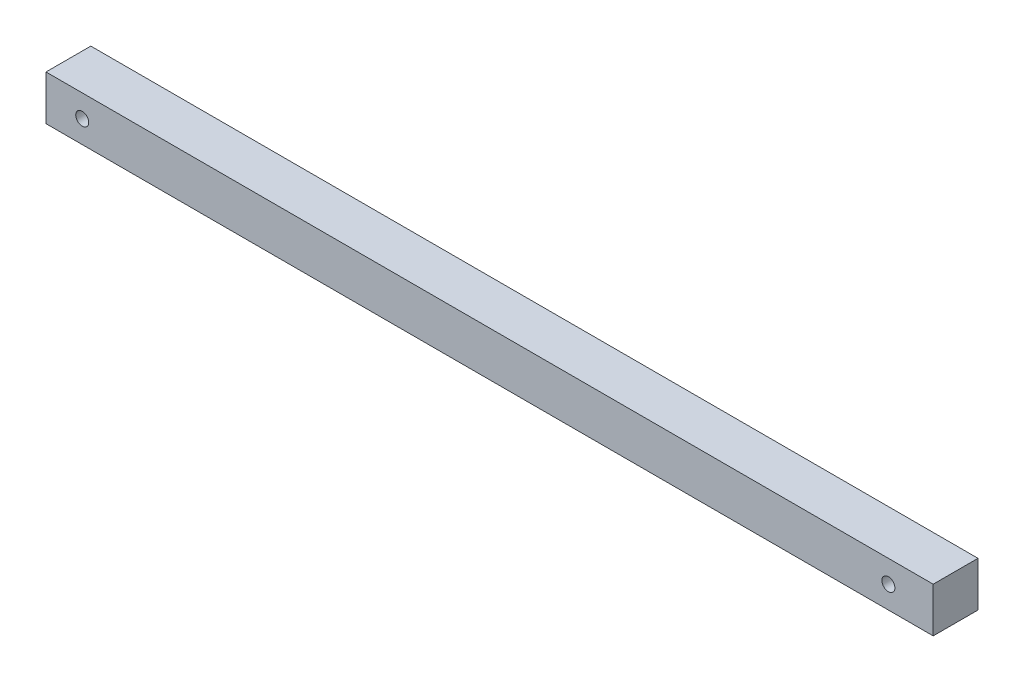
ISO-10303-21;
HEADER;
FILE_DESCRIPTION(('STEP AP214'),'2;1');
FILE_NAME('part.step','',(''),(''),'','','');
FILE_SCHEMA(('AUTOMOTIVE_DESIGN { 1 0 10303 214 1 1 1 1 }'));
ENDSEC;
DATA;
#1=APPLICATION_CONTEXT('core data for automotive mechanical design processes');
#2=APPLICATION_PROTOCOL_DEFINITION('international standard','automotive_design',2000,#1);
#3=PRODUCT_CONTEXT('',#1,'mechanical');
#4=PRODUCT('Part','Part','',(#3));
#5=PRODUCT_RELATED_PRODUCT_CATEGORY('part','',(#4));
#6=PRODUCT_DEFINITION_FORMATION('','',#4);
#7=PRODUCT_DEFINITION_CONTEXT('part definition',#1,'design');
#8=PRODUCT_DEFINITION('design','',#6,#7);
#9=PRODUCT_DEFINITION_SHAPE('','',#8);
#10=(LENGTH_UNIT() NAMED_UNIT(*) SI_UNIT(.MILLI.,.METRE.));
#11=(NAMED_UNIT(*) PLANE_ANGLE_UNIT() SI_UNIT($,.RADIAN.));
#12=(NAMED_UNIT(*) SI_UNIT($,.STERADIAN.) SOLID_ANGLE_UNIT());
#13=UNCERTAINTY_MEASURE_WITH_UNIT(LENGTH_MEASURE(1.E-05),#10,'distance_accuracy_value','');
#14=(GEOMETRIC_REPRESENTATION_CONTEXT(3) GLOBAL_UNCERTAINTY_ASSIGNED_CONTEXT((#13)) GLOBAL_UNIT_ASSIGNED_CONTEXT((#10,
#11,#12)) REPRESENTATION_CONTEXT('',''));
#15=CARTESIAN_POINT('',(0.,0.,0.));
#16=DIRECTION('',(0.,0.,1.));
#17=DIRECTION('',(1.,0.,0.));
#18=AXIS2_PLACEMENT_3D('',#15,#16,#17);
#19=CARTESIAN_POINT('',(-99.,4.99999999999999,5.));
#20=DIRECTION('',(1.,0.,0.));
#21=DIRECTION('',(0.,0.,-1.));
#22=AXIS2_PLACEMENT_3D('',#19,#20,#21);
#23=PLANE('',#22);
#24=DIRECTION('',(0.,-1.,0.));
#25=VECTOR('',#24,1.);
#26=CARTESIAN_POINT('',(-99.,4.99999999999999,-5.));
#27=LINE('',#26,#25);
#28=CARTESIAN_POINT('',(-99.,4.99999999999999,-5.));
#29=VERTEX_POINT('',#28);
#30=CARTESIAN_POINT('',(-99.,-5.00000000000001,-5.));
#31=VERTEX_POINT('',#30);
#32=EDGE_CURVE('E96',#29,#31,#27,.T.);
#33=ORIENTED_EDGE('',*,*,#32,.T.);
#34=DIRECTION('',(0.,0.,-1.));
#35=VECTOR('',#34,1.);
#36=CARTESIAN_POINT('',(-99.,-5.00000000000001,5.));
#37=LINE('',#36,#35);
#38=CARTESIAN_POINT('',(-99.,-5.00000000000001,5.));
#39=VERTEX_POINT('',#38);
#40=EDGE_CURVE('E11',#39,#31,#37,.T.);
#41=ORIENTED_EDGE('',*,*,#40,.F.);
#42=DIRECTION('',(0.,-1.,0.));
#43=VECTOR('',#42,1.);
#44=CARTESIAN_POINT('',(-99.,4.99999999999999,5.));
#45=LINE('',#44,#43);
#46=CARTESIAN_POINT('',(-99.,4.99999999999999,5.));
#47=VERTEX_POINT('',#46);
#48=EDGE_CURVE('E84',#47,#39,#45,.T.);
#49=ORIENTED_EDGE('',*,*,#48,.F.);
#50=DIRECTION('',(0.,0.,-1.));
#51=VECTOR('',#50,1.);
#52=CARTESIAN_POINT('',(-99.,4.99999999999999,5.));
#53=LINE('',#52,#51);
#54=EDGE_CURVE('E92',#47,#29,#53,.T.);
#55=ORIENTED_EDGE('',*,*,#54,.T.);
#56=EDGE_LOOP('',(#33,#41,#49,#55));
#57=FACE_BOUND('',#56,.T.);
#58=ADVANCED_FACE('F33',(#57),#23,.F.);
#59=CARTESIAN_POINT('',(99.,-4.99999999999999,5.));
#60=DIRECTION('',(0.,1.,0.));
#61=DIRECTION('',(-1.,0.,0.));
#62=AXIS2_PLACEMENT_3D('',#59,#60,#61);
#63=PLANE('',#62);
#64=DIRECTION('',(1.,0.,0.));
#65=VECTOR('',#64,1.);
#66=CARTESIAN_POINT('',(99.,-4.99999999999999,-5.));
#67=LINE('',#66,#65);
#68=CARTESIAN_POINT('',(99.,-4.99999999999999,-5.));
#69=VERTEX_POINT('',#68);
#70=EDGE_CURVE('E88',#31,#69,#67,.T.);
#71=ORIENTED_EDGE('',*,*,#70,.T.);
#72=DIRECTION('',(0.,0.,-1.));
#73=VECTOR('',#72,1.);
#74=CARTESIAN_POINT('',(99.,-4.99999999999999,5.));
#75=LINE('',#74,#73);
#76=CARTESIAN_POINT('',(99.,-4.99999999999999,5.));
#77=VERTEX_POINT('',#76);
#78=EDGE_CURVE('E41',#77,#69,#75,.T.);
#79=ORIENTED_EDGE('',*,*,#78,.F.);
#80=DIRECTION('',(1.,0.,0.));
#81=VECTOR('',#80,1.);
#82=CARTESIAN_POINT('',(99.,-4.99999999999999,5.));
#83=LINE('',#82,#81);
#84=EDGE_CURVE('E79',#39,#77,#83,.T.);
#85=ORIENTED_EDGE('',*,*,#84,.F.);
#86=ORIENTED_EDGE('',*,*,#40,.T.);
#87=EDGE_LOOP('',(#71,#79,#85,#86));
#88=FACE_BOUND('',#87,.T.);
#89=ADVANCED_FACE('F87',(#88),#63,.F.);
#90=CARTESIAN_POINT('',(99.,5.00000000000001,5.));
#91=DIRECTION('',(-1.,0.,0.));
#92=DIRECTION('',(0.,0.,1.));
#93=AXIS2_PLACEMENT_3D('',#90,#91,#92);
#94=PLANE('',#93);
#95=DIRECTION('',(0.,1.,0.));
#96=VECTOR('',#95,1.);
#97=CARTESIAN_POINT('',(99.,5.00000000000001,-5.));
#98=LINE('',#97,#96);
#99=CARTESIAN_POINT('',(99.,5.00000000000001,-5.));
#100=VERTEX_POINT('',#99);
#101=EDGE_CURVE('E66',#69,#100,#98,.T.);
#102=ORIENTED_EDGE('',*,*,#101,.T.);
#103=DIRECTION('',(0.,0.,-1.));
#104=VECTOR('',#103,1.);
#105=CARTESIAN_POINT('',(99.,5.00000000000001,5.));
#106=LINE('',#105,#104);
#107=CARTESIAN_POINT('',(99.,5.00000000000001,5.));
#108=VERTEX_POINT('',#107);
#109=EDGE_CURVE('E89',#108,#100,#106,.T.);
#110=ORIENTED_EDGE('',*,*,#109,.F.);
#111=DIRECTION('',(0.,1.,0.));
#112=VECTOR('',#111,1.);
#113=CARTESIAN_POINT('',(99.,5.00000000000001,5.));
#114=LINE('',#113,#112);
#115=EDGE_CURVE('E82',#77,#108,#114,.T.);
#116=ORIENTED_EDGE('',*,*,#115,.F.);
#117=ORIENTED_EDGE('',*,*,#78,.T.);
#118=EDGE_LOOP('',(#102,#110,#116,#117));
#119=FACE_BOUND('',#118,.T.);
#120=ADVANCED_FACE('F90',(#119),#94,.F.);
#121=CARTESIAN_POINT('',(99.,5.00000000000001,5.));
#122=DIRECTION('',(0.,-1.,0.));
#123=DIRECTION('',(1.,0.,0.));
#124=AXIS2_PLACEMENT_3D('',#121,#122,#123);
#125=PLANE('',#124);
#126=DIRECTION('',(-1.,0.,0.));
#127=VECTOR('',#126,1.);
#128=CARTESIAN_POINT('',(99.,5.00000000000001,-5.));
#129=LINE('',#128,#127);
#130=EDGE_CURVE('E72',#100,#29,#129,.T.);
#131=ORIENTED_EDGE('',*,*,#130,.T.);
#132=ORIENTED_EDGE('',*,*,#54,.F.);
#133=DIRECTION('',(-1.,0.,0.));
#134=VECTOR('',#133,1.);
#135=CARTESIAN_POINT('',(99.,5.00000000000001,5.));
#136=LINE('',#135,#134);
#137=EDGE_CURVE('E49',#108,#47,#136,.T.);
#138=ORIENTED_EDGE('',*,*,#137,.F.);
#139=ORIENTED_EDGE('',*,*,#109,.T.);
#140=EDGE_LOOP('',(#131,#132,#138,#139));
#141=FACE_BOUND('',#140,.T.);
#142=ADVANCED_FACE('F104',(#141),#125,.F.);
#143=CARTESIAN_POINT('',(0.,0.,5.));
#144=DIRECTION('',(0.,0.,-1.));
#145=DIRECTION('',(-1.,0.,0.));
#146=AXIS2_PLACEMENT_3D('',#143,#144,#145);
#147=PLANE('',#146);
#148=CARTESIAN_POINT('',(89.,0.,5.));
#149=DIRECTION('',(0.,0.,-1.));
#150=DIRECTION('',(-1.,0.,0.));
#151=AXIS2_PLACEMENT_3D('',#148,#149,#150);
#152=CIRCLE('',#151,1.44999999999999);
#153=CARTESIAN_POINT('',(87.55,0.,5.));
#154=VERTEX_POINT('',#153);
#155=EDGE_CURVE('E115',#154,#154,#152,.T.);
#156=ORIENTED_EDGE('',*,*,#155,.T.);
#157=EDGE_LOOP('',(#156));
#158=FACE_BOUND('',#157,.T.);
#159=CARTESIAN_POINT('',(-90.9182,0.,5.));
#160=DIRECTION('',(0.,0.,-1.));
#161=DIRECTION('',(-1.,0.,0.));
#162=AXIS2_PLACEMENT_3D('',#159,#160,#161);
#163=CIRCLE('',#162,1.44999999999999);
#164=CARTESIAN_POINT('',(-92.3682,0.,5.));
#165=VERTEX_POINT('',#164);
#166=EDGE_CURVE('E99',#165,#165,#163,.T.);
#167=ORIENTED_EDGE('',*,*,#166,.T.);
#168=EDGE_LOOP('',(#167));
#169=FACE_BOUND('',#168,.T.);
#170=ORIENTED_EDGE('',*,*,#48,.T.);
#171=ORIENTED_EDGE('',*,*,#84,.T.);
#172=ORIENTED_EDGE('',*,*,#115,.T.);
#173=ORIENTED_EDGE('',*,*,#137,.T.);
#174=EDGE_LOOP('',(#170,#171,#172,#173));
#175=FACE_BOUND('',#174,.T.);
#176=ADVANCED_FACE('F80',(#158,#169,#175),#147,.F.);
#177=CARTESIAN_POINT('',(0.,0.,-5.));
#178=DIRECTION('',(0.,0.,-1.));
#179=DIRECTION('',(-1.,0.,0.));
#180=AXIS2_PLACEMENT_3D('',#177,#178,#179);
#181=PLANE('',#180);
#182=CARTESIAN_POINT('',(89.,0.,-5.));
#183=DIRECTION('',(0.,0.,-1.));
#184=DIRECTION('',(-1.,0.,0.));
#185=AXIS2_PLACEMENT_3D('',#182,#183,#184);
#186=CIRCLE('',#185,1.44999999999999);
#187=CARTESIAN_POINT('',(87.55,0.,-5.));
#188=VERTEX_POINT('',#187);
#189=EDGE_CURVE('E118',#188,#188,#186,.T.);
#190=ORIENTED_EDGE('',*,*,#189,.F.);
#191=EDGE_LOOP('',(#190));
#192=FACE_BOUND('',#191,.T.);
#193=CARTESIAN_POINT('',(-90.9182,0.,-5.));
#194=DIRECTION('',(0.,0.,-1.));
#195=DIRECTION('',(-1.,0.,0.));
#196=AXIS2_PLACEMENT_3D('',#193,#194,#195);
#197=CIRCLE('',#196,1.44999999999999);
#198=CARTESIAN_POINT('',(-92.3682,0.,-5.));
#199=VERTEX_POINT('',#198);
#200=EDGE_CURVE('E112',#199,#199,#197,.T.);
#201=ORIENTED_EDGE('',*,*,#200,.F.);
#202=EDGE_LOOP('',(#201));
#203=FACE_BOUND('',#202,.T.);
#204=ORIENTED_EDGE('',*,*,#32,.F.);
#205=ORIENTED_EDGE('',*,*,#130,.F.);
#206=ORIENTED_EDGE('',*,*,#101,.F.);
#207=ORIENTED_EDGE('',*,*,#70,.F.);
#208=EDGE_LOOP('',(#204,#205,#206,#207));
#209=FACE_BOUND('',#208,.T.);
#210=ADVANCED_FACE('F107',(#192,#203,#209),#181,.T.);
#211=CARTESIAN_POINT('',(-90.9182,0.,-5.));
#212=DIRECTION('',(0.,0.,-1.));
#213=DIRECTION('',(-1.,0.,0.));
#214=AXIS2_PLACEMENT_3D('',#211,#212,#213);
#215=CYLINDRICAL_SURFACE('',#214,1.44999999999999);
#216=ORIENTED_EDGE('',*,*,#166,.F.);
#217=EDGE_LOOP('',(#216));
#218=FACE_BOUND('',#217,.T.);
#219=ORIENTED_EDGE('',*,*,#200,.T.);
#220=EDGE_LOOP('',(#219));
#221=FACE_BOUND('',#220,.T.);
#222=ADVANCED_FACE('F126',(#218,#221),#215,.F.);
#223=CARTESIAN_POINT('',(89.,0.,-5.));
#224=DIRECTION('',(0.,0.,-1.));
#225=DIRECTION('',(-1.,0.,0.));
#226=AXIS2_PLACEMENT_3D('',#223,#224,#225);
#227=CYLINDRICAL_SURFACE('',#226,1.44999999999999);
#228=ORIENTED_EDGE('',*,*,#155,.F.);
#229=EDGE_LOOP('',(#228));
#230=FACE_BOUND('',#229,.T.);
#231=ORIENTED_EDGE('',*,*,#189,.T.);
#232=EDGE_LOOP('',(#231));
#233=FACE_BOUND('',#232,.T.);
#234=ADVANCED_FACE('F122',(#230,#233),#227,.F.);
#235=CLOSED_SHELL('',(#58,#89,#120,#142,#176,#210,#222,#234));
#236=MANIFOLD_SOLID_BREP('B2',#235);
#237=ADVANCED_BREP_SHAPE_REPRESENTATION('',(#18,#236),#14);
#238=SHAPE_DEFINITION_REPRESENTATION(#9,#237);
ENDSEC;
END-ISO-10303-21;
